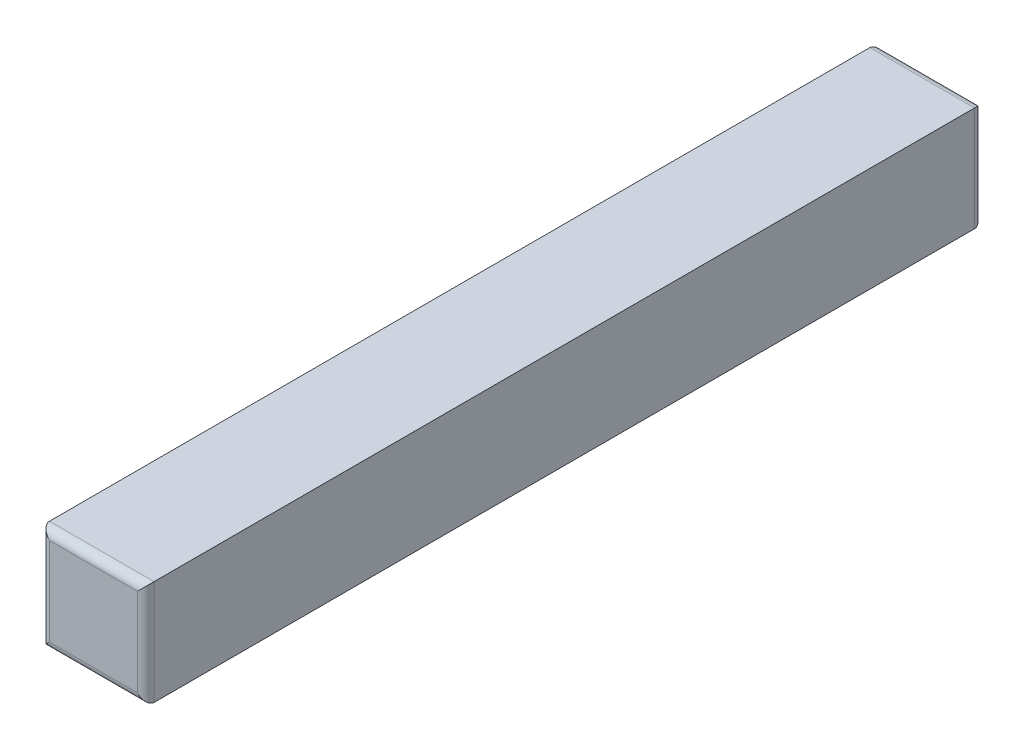
ISO-10303-21;
HEADER;
FILE_DESCRIPTION(('STEP AP214'),'2;1');
FILE_NAME('part.step','',(''),(''),'','','');
FILE_SCHEMA(('AUTOMOTIVE_DESIGN { 1 0 10303 214 1 1 1 1 }'));
ENDSEC;
DATA;
#1=APPLICATION_CONTEXT('core data for automotive mechanical design processes');
#2=APPLICATION_PROTOCOL_DEFINITION('international standard','automotive_design',2000,#1);
#3=PRODUCT_CONTEXT('',#1,'mechanical');
#4=PRODUCT('Part','Part','',(#3));
#5=PRODUCT_RELATED_PRODUCT_CATEGORY('part','',(#4));
#6=PRODUCT_DEFINITION_FORMATION('','',#4);
#7=PRODUCT_DEFINITION_CONTEXT('part definition',#1,'design');
#8=PRODUCT_DEFINITION('design','',#6,#7);
#9=PRODUCT_DEFINITION_SHAPE('','',#8);
#10=(LENGTH_UNIT() NAMED_UNIT(*) SI_UNIT(.MILLI.,.METRE.));
#11=(NAMED_UNIT(*) PLANE_ANGLE_UNIT() SI_UNIT($,.RADIAN.));
#12=(NAMED_UNIT(*) SI_UNIT($,.STERADIAN.) SOLID_ANGLE_UNIT());
#13=UNCERTAINTY_MEASURE_WITH_UNIT(LENGTH_MEASURE(1.E-05),#10,'distance_accuracy_value','');
#14=(GEOMETRIC_REPRESENTATION_CONTEXT(3) GLOBAL_UNCERTAINTY_ASSIGNED_CONTEXT((#13)) GLOBAL_UNIT_ASSIGNED_CONTEXT((#10,
#11,#12)) REPRESENTATION_CONTEXT('',''));
#15=CARTESIAN_POINT('',(0.,0.,0.));
#16=DIRECTION('',(0.,0.,1.));
#17=DIRECTION('',(1.,0.,0.));
#18=AXIS2_PLACEMENT_3D('',#15,#16,#17);
#19=CARTESIAN_POINT('',(0.,0.,-25.4));
#20=DIRECTION('',(-1.,0.,0.));
#21=DIRECTION('',(0.,0.,1.));
#22=AXIS2_PLACEMENT_3D('',#19,#20,#21);
#23=PLANE('',#22);
#24=DIRECTION('',(0.,0.,1.));
#25=VECTOR('',#24,1.);
#26=CARTESIAN_POINT('',(0.,3.175,-25.4));
#27=LINE('',#26,#25);
#28=CARTESIAN_POINT('',(0.,3.175,-25.146));
#29=VERTEX_POINT('',#28);
#30=CARTESIAN_POINT('',(0.,3.175,-0.254000000000001));
#31=VERTEX_POINT('',#30);
#32=EDGE_CURVE('E121',#29,#31,#27,.T.);
#33=ORIENTED_EDGE('',*,*,#32,.F.);
#34=DIRECTION('',(0.,-1.,0.));
#35=VECTOR('',#34,1.);
#36=CARTESIAN_POINT('',(0.,0.,-25.146));
#37=LINE('',#36,#35);
#38=CARTESIAN_POINT('',(0.,0.,-25.146));
#39=VERTEX_POINT('',#38);
#40=EDGE_CURVE('E11',#29,#39,#37,.T.);
#41=ORIENTED_EDGE('',*,*,#40,.T.);
#42=DIRECTION('',(0.,0.,1.));
#43=VECTOR('',#42,1.);
#44=CARTESIAN_POINT('',(0.,0.,-25.4));
#45=LINE('',#44,#43);
#46=CARTESIAN_POINT('',(0.,0.,-0.254000000000001));
#47=VERTEX_POINT('',#46);
#48=EDGE_CURVE('E147',#39,#47,#45,.T.);
#49=ORIENTED_EDGE('',*,*,#48,.T.);
#50=DIRECTION('',(0.,-1.,0.));
#51=VECTOR('',#50,1.);
#52=CARTESIAN_POINT('',(0.,3.175,-0.254));
#53=LINE('',#52,#51);
#54=EDGE_CURVE('E138',#47,#31,#53,.F.);
#55=ORIENTED_EDGE('',*,*,#54,.T.);
#56=EDGE_LOOP('',(#33,#41,#49,#55));
#57=FACE_BOUND('',#56,.T.);
#58=ADVANCED_FACE('F34',(#57),#23,.T.);
#59=CARTESIAN_POINT('',(0.,3.175,-25.4));
#60=DIRECTION('',(0.,1.,0.));
#61=DIRECTION('',(0.,0.,1.));
#62=AXIS2_PLACEMENT_3D('',#59,#60,#61);
#63=PLANE('',#62);
#64=DIRECTION('',(0.,0.,1.));
#65=VECTOR('',#64,1.);
#66=CARTESIAN_POINT('',(3.175,3.175,-25.4));
#67=LINE('',#66,#65);
#68=CARTESIAN_POINT('',(3.175,3.175,-25.146));
#69=VERTEX_POINT('',#68);
#70=CARTESIAN_POINT('',(3.175,3.175,-0.254000000000001));
#71=VERTEX_POINT('',#70);
#72=EDGE_CURVE('E193',#69,#71,#67,.T.);
#73=ORIENTED_EDGE('',*,*,#72,.F.);
#74=DIRECTION('',(-1.,0.,0.));
#75=VECTOR('',#74,1.);
#76=CARTESIAN_POINT('',(0.,3.175,-25.146));
#77=LINE('',#76,#75);
#78=EDGE_CURVE('E43',#69,#29,#77,.T.);
#79=ORIENTED_EDGE('',*,*,#78,.T.);
#80=ORIENTED_EDGE('',*,*,#32,.T.);
#81=DIRECTION('',(-1.,0.,0.));
#82=VECTOR('',#81,1.);
#83=CARTESIAN_POINT('',(3.175,3.175,-0.254));
#84=LINE('',#83,#82);
#85=EDGE_CURVE('E108',#31,#71,#84,.F.);
#86=ORIENTED_EDGE('',*,*,#85,.T.);
#87=EDGE_LOOP('',(#73,#79,#80,#86));
#88=FACE_BOUND('',#87,.T.);
#89=ADVANCED_FACE('F203',(#88),#63,.T.);
#90=CARTESIAN_POINT('',(3.175,0.,-25.4));
#91=DIRECTION('',(1.,0.,0.));
#92=DIRECTION('',(0.,0.,-1.));
#93=AXIS2_PLACEMENT_3D('',#90,#91,#92);
#94=PLANE('',#93);
#95=DIRECTION('',(0.,0.,1.));
#96=VECTOR('',#95,1.);
#97=CARTESIAN_POINT('',(3.175,0.,-25.4));
#98=LINE('',#97,#96);
#99=CARTESIAN_POINT('',(3.175,0.,-25.146));
#100=VERTEX_POINT('',#99);
#101=CARTESIAN_POINT('',(3.175,0.,-0.254000000000001));
#102=VERTEX_POINT('',#101);
#103=EDGE_CURVE('E189',#100,#102,#98,.T.);
#104=ORIENTED_EDGE('',*,*,#103,.F.);
#105=DIRECTION('',(0.,1.,0.));
#106=VECTOR('',#105,1.);
#107=CARTESIAN_POINT('',(3.175,0.,-25.146));
#108=LINE('',#107,#106);
#109=EDGE_CURVE('E58',#100,#69,#108,.T.);
#110=ORIENTED_EDGE('',*,*,#109,.T.);
#111=ORIENTED_EDGE('',*,*,#72,.T.);
#112=DIRECTION('',(0.,1.,0.));
#113=VECTOR('',#112,1.);
#114=CARTESIAN_POINT('',(3.175,0.,-0.254));
#115=LINE('',#114,#113);
#116=EDGE_CURVE('E128',#71,#102,#115,.F.);
#117=ORIENTED_EDGE('',*,*,#116,.T.);
#118=EDGE_LOOP('',(#104,#110,#111,#117));
#119=FACE_BOUND('',#118,.T.);
#120=ADVANCED_FACE('F190',(#119),#94,.T.);
#121=CARTESIAN_POINT('',(0.,0.,-25.4));
#122=DIRECTION('',(0.,-1.,0.));
#123=DIRECTION('',(0.,0.,-1.));
#124=AXIS2_PLACEMENT_3D('',#121,#122,#123);
#125=PLANE('',#124);
#126=ORIENTED_EDGE('',*,*,#48,.F.);
#127=DIRECTION('',(1.,0.,0.));
#128=VECTOR('',#127,1.);
#129=CARTESIAN_POINT('',(0.,0.,-25.146));
#130=LINE('',#129,#128);
#131=EDGE_CURVE('E140',#39,#100,#130,.T.);
#132=ORIENTED_EDGE('',*,*,#131,.T.);
#133=ORIENTED_EDGE('',*,*,#103,.T.);
#134=DIRECTION('',(1.,0.,0.));
#135=VECTOR('',#134,1.);
#136=CARTESIAN_POINT('',(0.,0.,-0.254));
#137=LINE('',#136,#135);
#138=EDGE_CURVE('E135',#102,#47,#137,.F.);
#139=ORIENTED_EDGE('',*,*,#138,.T.);
#140=EDGE_LOOP('',(#126,#132,#133,#139));
#141=FACE_BOUND('',#140,.T.);
#142=ADVANCED_FACE('F188',(#141),#125,.T.);
#143=CARTESIAN_POINT('',(0.,0.,-25.4));
#144=DIRECTION('',(0.,0.,-1.));
#145=DIRECTION('',(-1.,0.,0.));
#146=AXIS2_PLACEMENT_3D('',#143,#144,#145);
#147=PLANE('',#146);
#148=DIRECTION('',(0.,1.,0.));
#149=VECTOR('',#148,1.);
#150=CARTESIAN_POINT('',(2.921,0.,-25.4));
#151=LINE('',#150,#149);
#152=CARTESIAN_POINT('',(2.921,2.921,-25.4));
#153=VERTEX_POINT('',#152);
#154=CARTESIAN_POINT('',(2.921,0.254,-25.4));
#155=VERTEX_POINT('',#154);
#156=EDGE_CURVE('E154',#153,#155,#151,.F.);
#157=ORIENTED_EDGE('',*,*,#156,.T.);
#158=DIRECTION('',(1.,0.,0.));
#159=VECTOR('',#158,1.);
#160=CARTESIAN_POINT('',(0.,0.254,-25.4));
#161=LINE('',#160,#159);
#162=CARTESIAN_POINT('',(0.254,0.254,-25.4));
#163=VERTEX_POINT('',#162);
#164=EDGE_CURVE('E156',#155,#163,#161,.F.);
#165=ORIENTED_EDGE('',*,*,#164,.T.);
#166=DIRECTION('',(0.,-1.,0.));
#167=VECTOR('',#166,1.);
#168=CARTESIAN_POINT('',(0.254,0.,-25.4));
#169=LINE('',#168,#167);
#170=CARTESIAN_POINT('',(0.254,2.921,-25.4));
#171=VERTEX_POINT('',#170);
#172=EDGE_CURVE('E150',#163,#171,#169,.F.);
#173=ORIENTED_EDGE('',*,*,#172,.T.);
#174=DIRECTION('',(-1.,0.,0.));
#175=VECTOR('',#174,1.);
#176=CARTESIAN_POINT('',(0.,2.921,-25.4));
#177=LINE('',#176,#175);
#178=EDGE_CURVE('E152',#171,#153,#177,.F.);
#179=ORIENTED_EDGE('',*,*,#178,.T.);
#180=EDGE_LOOP('',(#157,#165,#173,#179));
#181=FACE_BOUND('',#180,.T.);
#182=ADVANCED_FACE('F179',(#181),#147,.T.);
#183=CARTESIAN_POINT('',(0.,0.,0.));
#184=DIRECTION('',(0.,0.,-1.));
#185=DIRECTION('',(-1.,0.,0.));
#186=AXIS2_PLACEMENT_3D('',#183,#184,#185);
#187=PLANE('',#186);
#188=DIRECTION('',(0.,1.,0.));
#189=VECTOR('',#188,1.);
#190=CARTESIAN_POINT('',(2.921,3.175,0.));
#191=LINE('',#190,#189);
#192=CARTESIAN_POINT('',(2.921,0.254,0.));
#193=VERTEX_POINT('',#192);
#194=CARTESIAN_POINT('',(2.921,2.921,0.));
#195=VERTEX_POINT('',#194);
#196=EDGE_CURVE('E125',#193,#195,#191,.T.);
#197=ORIENTED_EDGE('',*,*,#196,.T.);
#198=DIRECTION('',(-1.,0.,0.));
#199=VECTOR('',#198,1.);
#200=CARTESIAN_POINT('',(0.,2.921,0.));
#201=LINE('',#200,#199);
#202=CARTESIAN_POINT('',(0.254,2.921,0.));
#203=VERTEX_POINT('',#202);
#204=EDGE_CURVE('E106',#195,#203,#201,.T.);
#205=ORIENTED_EDGE('',*,*,#204,.T.);
#206=DIRECTION('',(0.,-1.,0.));
#207=VECTOR('',#206,1.);
#208=CARTESIAN_POINT('',(0.254,0.,0.));
#209=LINE('',#208,#207);
#210=CARTESIAN_POINT('',(0.254,0.254,0.));
#211=VERTEX_POINT('',#210);
#212=EDGE_CURVE('E114',#203,#211,#209,.T.);
#213=ORIENTED_EDGE('',*,*,#212,.T.);
#214=DIRECTION('',(1.,0.,0.));
#215=VECTOR('',#214,1.);
#216=CARTESIAN_POINT('',(3.175,0.254,0.));
#217=LINE('',#216,#215);
#218=EDGE_CURVE('E120',#211,#193,#217,.T.);
#219=ORIENTED_EDGE('',*,*,#218,.T.);
#220=EDGE_LOOP('',(#197,#205,#213,#219));
#221=FACE_BOUND('',#220,.T.);
#222=ADVANCED_FACE('F123',(#221),#187,.F.);
#223=CARTESIAN_POINT('',(0.,0.254,-0.254));
#224=DIRECTION('',(-1.,0.,0.));
#225=DIRECTION('',(0.,0.,1.));
#226=AXIS2_PLACEMENT_3D('',#223,#224,#225);
#227=CYLINDRICAL_SURFACE('',#226,0.254);
#228=CARTESIAN_POINT('',(0.254,0.254,-0.254));
#229=DIRECTION('',(-0.707106781186547,0.707106781186547,0.));
#230=DIRECTION('',(0.707106781186547,0.707106781186547,0.));
#231=AXIS2_PLACEMENT_3D('',#228,#229,#230);
#232=ELLIPSE('',#231,0.359210244842766,0.254);
#233=EDGE_CURVE('E117',#47,#211,#232,.T.);
#234=ORIENTED_EDGE('',*,*,#233,.F.);
#235=ORIENTED_EDGE('',*,*,#138,.F.);
#236=CARTESIAN_POINT('',(2.921,0.254,-0.254));
#237=DIRECTION('',(-0.707106781186547,-0.707106781186547,0.));
#238=DIRECTION('',(-0.707106781186547,0.707106781186547,0.));
#239=AXIS2_PLACEMENT_3D('',#236,#237,#238);
#240=ELLIPSE('',#239,0.359210244842766,0.254);
#241=EDGE_CURVE('E144',#193,#102,#240,.F.);
#242=ORIENTED_EDGE('',*,*,#241,.F.);
#243=ORIENTED_EDGE('',*,*,#218,.F.);
#244=EDGE_LOOP('',(#234,#235,#242,#243));
#245=FACE_BOUND('',#244,.T.);
#246=ADVANCED_FACE('F200',(#245),#227,.T.);
#247=CARTESIAN_POINT('',(2.921,0.,-0.254));
#248=DIRECTION('',(0.,-1.,0.));
#249=DIRECTION('',(0.,0.,-1.));
#250=AXIS2_PLACEMENT_3D('',#247,#248,#249);
#251=CYLINDRICAL_SURFACE('',#250,0.254);
#252=ORIENTED_EDGE('',*,*,#241,.T.);
#253=ORIENTED_EDGE('',*,*,#116,.F.);
#254=CARTESIAN_POINT('',(2.921,2.921,-0.254));
#255=DIRECTION('',(0.707106781186547,-0.707106781186547,0.));
#256=DIRECTION('',(-0.707106781186547,-0.707106781186547,0.));
#257=AXIS2_PLACEMENT_3D('',#254,#255,#256);
#258=ELLIPSE('',#257,0.359210244842766,0.254);
#259=EDGE_CURVE('E111',#195,#71,#258,.F.);
#260=ORIENTED_EDGE('',*,*,#259,.F.);
#261=ORIENTED_EDGE('',*,*,#196,.F.);
#262=EDGE_LOOP('',(#252,#253,#260,#261));
#263=FACE_BOUND('',#262,.T.);
#264=ADVANCED_FACE('F202',(#263),#251,.T.);
#265=CARTESIAN_POINT('',(0.254,0.,-0.254));
#266=DIRECTION('',(0.,1.,0.));
#267=DIRECTION('',(0.,0.,1.));
#268=AXIS2_PLACEMENT_3D('',#265,#266,#267);
#269=CYLINDRICAL_SURFACE('',#268,0.254);
#270=ORIENTED_EDGE('',*,*,#233,.T.);
#271=ORIENTED_EDGE('',*,*,#212,.F.);
#272=CARTESIAN_POINT('',(0.254,2.921,-0.254));
#273=DIRECTION('',(0.707106781186547,0.707106781186547,0.));
#274=DIRECTION('',(-0.707106781186547,0.707106781186547,0.));
#275=AXIS2_PLACEMENT_3D('',#272,#273,#274);
#276=ELLIPSE('',#275,0.359210244842766,0.254);
#277=EDGE_CURVE('E101',#31,#203,#276,.T.);
#278=ORIENTED_EDGE('',*,*,#277,.F.);
#279=ORIENTED_EDGE('',*,*,#54,.F.);
#280=EDGE_LOOP('',(#270,#271,#278,#279));
#281=FACE_BOUND('',#280,.T.);
#282=ADVANCED_FACE('F115',(#281),#269,.T.);
#283=CARTESIAN_POINT('',(0.,2.921,-0.254));
#284=DIRECTION('',(1.,0.,0.));
#285=DIRECTION('',(0.,0.,-1.));
#286=AXIS2_PLACEMENT_3D('',#283,#284,#285);
#287=CYLINDRICAL_SURFACE('',#286,0.254);
#288=ORIENTED_EDGE('',*,*,#259,.T.);
#289=ORIENTED_EDGE('',*,*,#85,.F.);
#290=ORIENTED_EDGE('',*,*,#277,.T.);
#291=ORIENTED_EDGE('',*,*,#204,.F.);
#292=EDGE_LOOP('',(#288,#289,#290,#291));
#293=FACE_BOUND('',#292,.T.);
#294=ADVANCED_FACE('F104',(#293),#287,.T.);
#295=CARTESIAN_POINT('',(0.,2.921,-25.146));
#296=DIRECTION('',(-1.,0.,0.));
#297=DIRECTION('',(0.,0.,1.));
#298=AXIS2_PLACEMENT_3D('',#295,#296,#297);
#299=CYLINDRICAL_SURFACE('',#298,0.254);
#300=CARTESIAN_POINT('',(2.921,2.921,-25.146));
#301=DIRECTION('',(-0.707106781186547,0.707106781186547,0.));
#302=DIRECTION('',(-0.707106781186547,-0.707106781186547,0.));
#303=AXIS2_PLACEMENT_3D('',#300,#301,#302);
#304=ELLIPSE('',#303,0.359210244842766,0.254);
#305=EDGE_CURVE('E164',#153,#69,#304,.F.);
#306=ORIENTED_EDGE('',*,*,#305,.F.);
#307=ORIENTED_EDGE('',*,*,#178,.F.);
#308=CARTESIAN_POINT('',(0.254,2.921,-25.146));
#309=DIRECTION('',(-0.707106781186547,-0.707106781186547,0.));
#310=DIRECTION('',(0.707106781186547,-0.707106781186547,0.));
#311=AXIS2_PLACEMENT_3D('',#308,#309,#310);
#312=ELLIPSE('',#311,0.359210244842766,0.254);
#313=EDGE_CURVE('E38',#29,#171,#312,.T.);
#314=ORIENTED_EDGE('',*,*,#313,.F.);
#315=ORIENTED_EDGE('',*,*,#78,.F.);
#316=EDGE_LOOP('',(#306,#307,#314,#315));
#317=FACE_BOUND('',#316,.T.);
#318=ADVANCED_FACE('F36',(#317),#299,.T.);
#319=CARTESIAN_POINT('',(0.254,0.,-25.146));
#320=DIRECTION('',(0.,-1.,0.));
#321=DIRECTION('',(0.,0.,-1.));
#322=AXIS2_PLACEMENT_3D('',#319,#320,#321);
#323=CYLINDRICAL_SURFACE('',#322,0.254);
#324=ORIENTED_EDGE('',*,*,#313,.T.);
#325=ORIENTED_EDGE('',*,*,#172,.F.);
#326=CARTESIAN_POINT('',(0.254,0.254,-25.146));
#327=DIRECTION('',(0.707106781186547,-0.707106781186547,0.));
#328=DIRECTION('',(-0.707106781186547,-0.707106781186547,0.));
#329=AXIS2_PLACEMENT_3D('',#326,#327,#328);
#330=ELLIPSE('',#329,0.359210244842766,0.254);
#331=EDGE_CURVE('E163',#39,#163,#330,.T.);
#332=ORIENTED_EDGE('',*,*,#331,.F.);
#333=ORIENTED_EDGE('',*,*,#40,.F.);
#334=EDGE_LOOP('',(#324,#325,#332,#333));
#335=FACE_BOUND('',#334,.T.);
#336=ADVANCED_FACE('F174',(#335),#323,.T.);
#337=CARTESIAN_POINT('',(2.921,0.,-25.146));
#338=DIRECTION('',(0.,1.,0.));
#339=DIRECTION('',(0.,0.,1.));
#340=AXIS2_PLACEMENT_3D('',#337,#338,#339);
#341=CYLINDRICAL_SURFACE('',#340,0.254);
#342=ORIENTED_EDGE('',*,*,#305,.T.);
#343=ORIENTED_EDGE('',*,*,#109,.F.);
#344=CARTESIAN_POINT('',(2.921,0.254,-25.146));
#345=DIRECTION('',(0.707106781186547,0.707106781186547,0.));
#346=DIRECTION('',(-0.707106781186547,0.707106781186547,0.));
#347=AXIS2_PLACEMENT_3D('',#344,#345,#346);
#348=ELLIPSE('',#347,0.359210244842766,0.254);
#349=EDGE_CURVE('E161',#155,#100,#348,.F.);
#350=ORIENTED_EDGE('',*,*,#349,.F.);
#351=ORIENTED_EDGE('',*,*,#156,.F.);
#352=EDGE_LOOP('',(#342,#343,#350,#351));
#353=FACE_BOUND('',#352,.T.);
#354=ADVANCED_FACE('F185',(#353),#341,.T.);
#355=CARTESIAN_POINT('',(0.,0.254,-25.146));
#356=DIRECTION('',(1.,0.,0.));
#357=DIRECTION('',(0.,0.,-1.));
#358=AXIS2_PLACEMENT_3D('',#355,#356,#357);
#359=CYLINDRICAL_SURFACE('',#358,0.254);
#360=ORIENTED_EDGE('',*,*,#331,.T.);
#361=ORIENTED_EDGE('',*,*,#164,.F.);
#362=ORIENTED_EDGE('',*,*,#349,.T.);
#363=ORIENTED_EDGE('',*,*,#131,.F.);
#364=EDGE_LOOP('',(#360,#361,#362,#363));
#365=FACE_BOUND('',#364,.T.);
#366=ADVANCED_FACE('F183',(#365),#359,.T.);
#367=CLOSED_SHELL('',(#58,#89,#120,#142,#182,#222,#246,#264,#282,#294,#318,#336,#354,#366));
#368=MANIFOLD_SOLID_BREP('B2',#367);
#369=ADVANCED_BREP_SHAPE_REPRESENTATION('',(#18,#368),#14);
#370=SHAPE_DEFINITION_REPRESENTATION(#9,#369);
ENDSEC;
END-ISO-10303-21;
